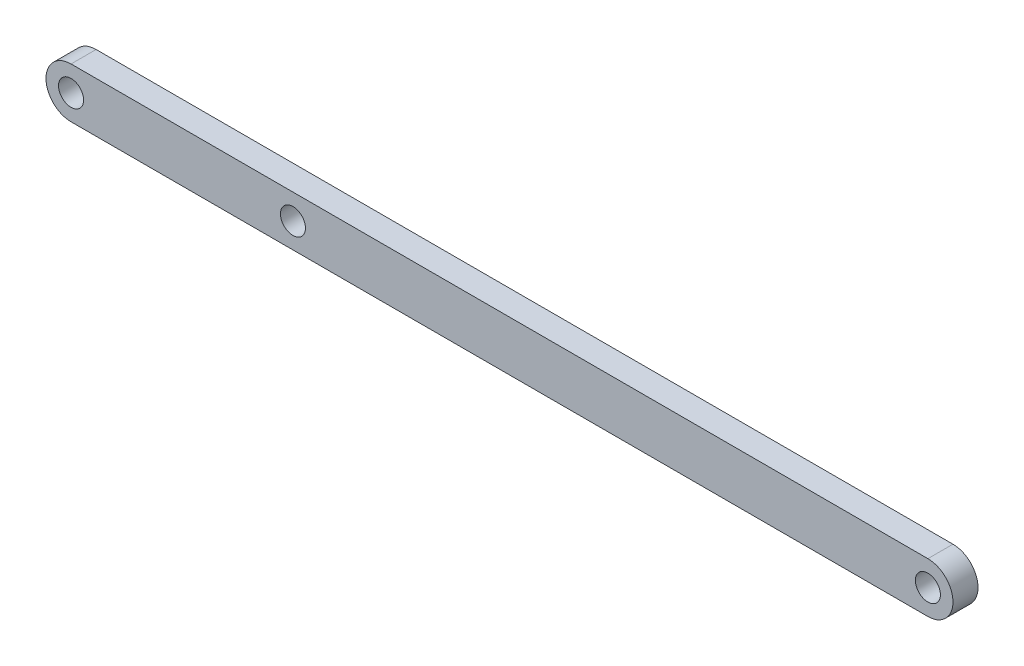
ISO-10303-21;
HEADER;
FILE_DESCRIPTION(('STEP AP214'),'2;1');
FILE_NAME('part.step','',(''),(''),'','','');
FILE_SCHEMA(('AUTOMOTIVE_DESIGN { 1 0 10303 214 1 1 1 1 }'));
ENDSEC;
DATA;
#1=APPLICATION_CONTEXT('core data for automotive mechanical design processes');
#2=APPLICATION_PROTOCOL_DEFINITION('international standard','automotive_design',2000,#1);
#3=PRODUCT_CONTEXT('',#1,'mechanical');
#4=PRODUCT('Part','Part','',(#3));
#5=PRODUCT_RELATED_PRODUCT_CATEGORY('part','',(#4));
#6=PRODUCT_DEFINITION_FORMATION('','',#4);
#7=PRODUCT_DEFINITION_CONTEXT('part definition',#1,'design');
#8=PRODUCT_DEFINITION('design','',#6,#7);
#9=PRODUCT_DEFINITION_SHAPE('','',#8);
#10=(LENGTH_UNIT() NAMED_UNIT(*) SI_UNIT(.MILLI.,.METRE.));
#11=(NAMED_UNIT(*) PLANE_ANGLE_UNIT() SI_UNIT($,.RADIAN.));
#12=(NAMED_UNIT(*) SI_UNIT($,.STERADIAN.) SOLID_ANGLE_UNIT());
#13=UNCERTAINTY_MEASURE_WITH_UNIT(LENGTH_MEASURE(1.E-05),#10,'distance_accuracy_value','');
#14=(GEOMETRIC_REPRESENTATION_CONTEXT(3) GLOBAL_UNCERTAINTY_ASSIGNED_CONTEXT((#13)) GLOBAL_UNIT_ASSIGNED_CONTEXT((#10,
#11,#12)) REPRESENTATION_CONTEXT('',''));
#15=CARTESIAN_POINT('',(0.,0.,0.));
#16=DIRECTION('',(0.,0.,1.));
#17=DIRECTION('',(1.,0.,0.));
#18=AXIS2_PLACEMENT_3D('',#15,#16,#17);
#19=CARTESIAN_POINT('',(85.49,0.,5.));
#20=DIRECTION('',(0.,0.,-1.));
#21=DIRECTION('',(-1.,0.,0.));
#22=AXIS2_PLACEMENT_3D('',#19,#20,#21);
#23=PLANE('',#22);
#24=CARTESIAN_POINT('',(85.49,0.,5.));
#25=DIRECTION('',(0.,0.,1.));
#26=DIRECTION('',(-1.,0.,0.));
#27=AXIS2_PLACEMENT_3D('',#24,#25,#26);
#28=CIRCLE('',#27,5.00000000000003);
#29=CARTESIAN_POINT('',(85.49,-5.00000000000003,5.));
#30=VERTEX_POINT('',#29);
#31=CARTESIAN_POINT('',(85.49,5.00000000000003,5.));
#32=VERTEX_POINT('',#31);
#33=EDGE_CURVE('E95',#30,#32,#28,.T.);
#34=ORIENTED_EDGE('',*,*,#33,.T.);
#35=DIRECTION('',(-1.,0.,0.));
#36=VECTOR('',#35,1.);
#37=CARTESIAN_POINT('',(-85.49,5.,5.));
#38=LINE('',#37,#36);
#39=CARTESIAN_POINT('',(-85.49,5.,5.));
#40=VERTEX_POINT('',#39);
#41=EDGE_CURVE('E90',#32,#40,#38,.T.);
#42=ORIENTED_EDGE('',*,*,#41,.T.);
#43=CARTESIAN_POINT('',(-85.49,0.,5.));
#44=DIRECTION('',(0.,0.,1.));
#45=DIRECTION('',(1.,0.,0.));
#46=AXIS2_PLACEMENT_3D('',#43,#44,#45);
#47=CIRCLE('',#46,5.00000000000003);
#48=CARTESIAN_POINT('',(-85.49,-5.00000000000003,5.));
#49=VERTEX_POINT('',#48);
#50=EDGE_CURVE('E93',#40,#49,#47,.T.);
#51=ORIENTED_EDGE('',*,*,#50,.T.);
#52=DIRECTION('',(1.,0.,0.));
#53=VECTOR('',#52,1.);
#54=CARTESIAN_POINT('',(-85.49,-5.00000000000006,5.));
#55=LINE('',#54,#53);
#56=EDGE_CURVE('E60',#49,#30,#55,.T.);
#57=ORIENTED_EDGE('',*,*,#56,.T.);
#58=EDGE_LOOP('',(#34,#42,#51,#57));
#59=FACE_BOUND('',#58,.T.);
#60=CARTESIAN_POINT('',(-85.49,0.,5.));
#61=DIRECTION('',(0.,0.,1.));
#62=DIRECTION('',(1.,0.,0.));
#63=AXIS2_PLACEMENT_3D('',#60,#61,#62);
#64=CIRCLE('',#63,2.50000000000001);
#65=CARTESIAN_POINT('',(-82.99,0.,5.));
#66=VERTEX_POINT('',#65);
#67=EDGE_CURVE('E115',#66,#66,#64,.T.);
#68=ORIENTED_EDGE('',*,*,#67,.F.);
#69=EDGE_LOOP('',(#68));
#70=FACE_BOUND('',#69,.T.);
#71=CARTESIAN_POINT('',(-41.21,0.,5.));
#72=DIRECTION('',(0.,0.,1.));
#73=DIRECTION('',(1.,0.,0.));
#74=AXIS2_PLACEMENT_3D('',#71,#72,#73);
#75=CIRCLE('',#74,2.5);
#76=CARTESIAN_POINT('',(-38.71,0.,5.));
#77=VERTEX_POINT('',#76);
#78=EDGE_CURVE('E137',#77,#77,#75,.T.);
#79=ORIENTED_EDGE('',*,*,#78,.F.);
#80=EDGE_LOOP('',(#79));
#81=FACE_BOUND('',#80,.T.);
#82=CARTESIAN_POINT('',(85.49,0.,5.));
#83=DIRECTION('',(0.,0.,1.));
#84=DIRECTION('',(1.,0.,0.));
#85=AXIS2_PLACEMENT_3D('',#82,#83,#84);
#86=CIRCLE('',#85,2.50000000000001);
#87=CARTESIAN_POINT('',(87.99,0.,5.));
#88=VERTEX_POINT('',#87);
#89=EDGE_CURVE('E145',#88,#88,#86,.T.);
#90=ORIENTED_EDGE('',*,*,#89,.F.);
#91=EDGE_LOOP('',(#90));
#92=FACE_BOUND('',#91,.T.);
#93=ADVANCED_FACE('F42',(#59,#70,#81,#92),#23,.F.);
#94=CARTESIAN_POINT('',(85.49,0.,0.));
#95=DIRECTION('',(0.,0.,-1.));
#96=DIRECTION('',(-1.,0.,0.));
#97=AXIS2_PLACEMENT_3D('',#94,#95,#96);
#98=PLANE('',#97);
#99=CARTESIAN_POINT('',(-41.21,0.,0.));
#100=DIRECTION('',(0.,0.,1.));
#101=DIRECTION('',(1.,0.,0.));
#102=AXIS2_PLACEMENT_3D('',#99,#100,#101);
#103=CIRCLE('',#102,2.5);
#104=CARTESIAN_POINT('',(-38.71,0.,0.));
#105=VERTEX_POINT('',#104);
#106=EDGE_CURVE('E141',#105,#105,#103,.T.);
#107=ORIENTED_EDGE('',*,*,#106,.T.);
#108=EDGE_LOOP('',(#107));
#109=FACE_BOUND('',#108,.T.);
#110=CARTESIAN_POINT('',(85.49,0.,0.));
#111=DIRECTION('',(0.,0.,1.));
#112=DIRECTION('',(-1.,0.,0.));
#113=AXIS2_PLACEMENT_3D('',#110,#111,#112);
#114=CIRCLE('',#113,5.00000000000003);
#115=CARTESIAN_POINT('',(85.49,-5.00000000000003,0.));
#116=VERTEX_POINT('',#115);
#117=CARTESIAN_POINT('',(85.49,5.00000000000003,0.));
#118=VERTEX_POINT('',#117);
#119=EDGE_CURVE('E111',#116,#118,#114,.T.);
#120=ORIENTED_EDGE('',*,*,#119,.F.);
#121=DIRECTION('',(1.,0.,0.));
#122=VECTOR('',#121,1.);
#123=CARTESIAN_POINT('',(-85.49,-5.00000000000006,0.));
#124=LINE('',#123,#122);
#125=CARTESIAN_POINT('',(-85.49,-5.00000000000003,0.));
#126=VERTEX_POINT('',#125);
#127=EDGE_CURVE('E83',#126,#116,#124,.T.);
#128=ORIENTED_EDGE('',*,*,#127,.F.);
#129=CARTESIAN_POINT('',(-85.49,0.,0.));
#130=DIRECTION('',(0.,0.,1.));
#131=DIRECTION('',(1.,0.,0.));
#132=AXIS2_PLACEMENT_3D('',#129,#130,#131);
#133=CIRCLE('',#132,5.00000000000003);
#134=CARTESIAN_POINT('',(-85.49,5.,0.));
#135=VERTEX_POINT('',#134);
#136=EDGE_CURVE('E77',#135,#126,#133,.T.);
#137=ORIENTED_EDGE('',*,*,#136,.F.);
#138=DIRECTION('',(-1.,0.,0.));
#139=VECTOR('',#138,1.);
#140=CARTESIAN_POINT('',(-85.49,5.,0.));
#141=LINE('',#140,#139);
#142=EDGE_CURVE('E100',#118,#135,#141,.T.);
#143=ORIENTED_EDGE('',*,*,#142,.F.);
#144=EDGE_LOOP('',(#120,#128,#137,#143));
#145=FACE_BOUND('',#144,.T.);
#146=CARTESIAN_POINT('',(-85.49,0.,0.));
#147=DIRECTION('',(0.,0.,1.));
#148=DIRECTION('',(1.,0.,0.));
#149=AXIS2_PLACEMENT_3D('',#146,#147,#148);
#150=CIRCLE('',#149,2.50000000000001);
#151=CARTESIAN_POINT('',(-82.99,0.,0.));
#152=VERTEX_POINT('',#151);
#153=EDGE_CURVE('E133',#152,#152,#150,.T.);
#154=ORIENTED_EDGE('',*,*,#153,.T.);
#155=EDGE_LOOP('',(#154));
#156=FACE_BOUND('',#155,.T.);
#157=CARTESIAN_POINT('',(85.49,0.,0.));
#158=DIRECTION('',(0.,0.,1.));
#159=DIRECTION('',(1.,0.,0.));
#160=AXIS2_PLACEMENT_3D('',#157,#158,#159);
#161=CIRCLE('',#160,2.50000000000001);
#162=CARTESIAN_POINT('',(87.99,0.,0.));
#163=VERTEX_POINT('',#162);
#164=EDGE_CURVE('E149',#163,#163,#161,.T.);
#165=ORIENTED_EDGE('',*,*,#164,.T.);
#166=EDGE_LOOP('',(#165));
#167=FACE_BOUND('',#166,.T.);
#168=ADVANCED_FACE('F128',(#109,#145,#156,#167),#98,.T.);
#169=CARTESIAN_POINT('',(85.49,0.,5.));
#170=DIRECTION('',(0.,0.,-1.));
#171=DIRECTION('',(-1.,0.,0.));
#172=AXIS2_PLACEMENT_3D('',#169,#170,#171);
#173=CYLINDRICAL_SURFACE('',#172,5.00000000000003);
#174=ORIENTED_EDGE('',*,*,#119,.T.);
#175=DIRECTION('',(0.,0.,-1.));
#176=VECTOR('',#175,1.);
#177=CARTESIAN_POINT('',(85.49,5.00000000000003,5.));
#178=LINE('',#177,#176);
#179=EDGE_CURVE('E11',#32,#118,#178,.T.);
#180=ORIENTED_EDGE('',*,*,#179,.F.);
#181=ORIENTED_EDGE('',*,*,#33,.F.);
#182=DIRECTION('',(0.,0.,-1.));
#183=VECTOR('',#182,1.);
#184=CARTESIAN_POINT('',(85.49,-5.00000000000003,5.));
#185=LINE('',#184,#183);
#186=EDGE_CURVE('E107',#30,#116,#185,.T.);
#187=ORIENTED_EDGE('',*,*,#186,.T.);
#188=EDGE_LOOP('',(#174,#180,#181,#187));
#189=FACE_BOUND('',#188,.T.);
#190=ADVANCED_FACE('F44',(#189),#173,.T.);
#191=CARTESIAN_POINT('',(-85.49,5.,5.));
#192=DIRECTION('',(0.,-1.,0.));
#193=DIRECTION('',(1.,0.,0.));
#194=AXIS2_PLACEMENT_3D('',#191,#192,#193);
#195=PLANE('',#194);
#196=ORIENTED_EDGE('',*,*,#142,.T.);
#197=DIRECTION('',(0.,0.,-1.));
#198=VECTOR('',#197,1.);
#199=CARTESIAN_POINT('',(-85.49,5.,5.));
#200=LINE('',#199,#198);
#201=EDGE_CURVE('E52',#40,#135,#200,.T.);
#202=ORIENTED_EDGE('',*,*,#201,.F.);
#203=ORIENTED_EDGE('',*,*,#41,.F.);
#204=ORIENTED_EDGE('',*,*,#179,.T.);
#205=EDGE_LOOP('',(#196,#202,#203,#204));
#206=FACE_BOUND('',#205,.T.);
#207=ADVANCED_FACE('F99',(#206),#195,.F.);
#208=CARTESIAN_POINT('',(-85.49,0.,5.));
#209=DIRECTION('',(0.,0.,-1.));
#210=DIRECTION('',(-1.,0.,0.));
#211=AXIS2_PLACEMENT_3D('',#208,#209,#210);
#212=CYLINDRICAL_SURFACE('',#211,5.00000000000003);
#213=ORIENTED_EDGE('',*,*,#136,.T.);
#214=DIRECTION('',(0.,0.,-1.));
#215=VECTOR('',#214,1.);
#216=CARTESIAN_POINT('',(-85.49,-5.00000000000003,5.));
#217=LINE('',#216,#215);
#218=EDGE_CURVE('E102',#49,#126,#217,.T.);
#219=ORIENTED_EDGE('',*,*,#218,.F.);
#220=ORIENTED_EDGE('',*,*,#50,.F.);
#221=ORIENTED_EDGE('',*,*,#201,.T.);
#222=EDGE_LOOP('',(#213,#219,#220,#221));
#223=FACE_BOUND('',#222,.T.);
#224=ADVANCED_FACE('F103',(#223),#212,.T.);
#225=CARTESIAN_POINT('',(-85.49,-5.00000000000006,5.));
#226=DIRECTION('',(0.,1.,0.));
#227=DIRECTION('',(-1.,0.,0.));
#228=AXIS2_PLACEMENT_3D('',#225,#226,#227);
#229=PLANE('',#228);
#230=ORIENTED_EDGE('',*,*,#127,.T.);
#231=ORIENTED_EDGE('',*,*,#186,.F.);
#232=ORIENTED_EDGE('',*,*,#56,.F.);
#233=ORIENTED_EDGE('',*,*,#218,.T.);
#234=EDGE_LOOP('',(#230,#231,#232,#233));
#235=FACE_BOUND('',#234,.T.);
#236=ADVANCED_FACE('F125',(#235),#229,.F.);
#237=CARTESIAN_POINT('',(-85.49,0.,5.));
#238=DIRECTION('',(0.,0.,-1.));
#239=DIRECTION('',(-1.,0.,0.));
#240=AXIS2_PLACEMENT_3D('',#237,#238,#239);
#241=CYLINDRICAL_SURFACE('',#240,2.50000000000001);
#242=ORIENTED_EDGE('',*,*,#67,.T.);
#243=EDGE_LOOP('',(#242));
#244=FACE_BOUND('',#243,.T.);
#245=ORIENTED_EDGE('',*,*,#153,.F.);
#246=EDGE_LOOP('',(#245));
#247=FACE_BOUND('',#246,.T.);
#248=ADVANCED_FACE('F168',(#244,#247),#241,.F.);
#249=CARTESIAN_POINT('',(-41.21,0.,5.));
#250=DIRECTION('',(0.,0.,-1.));
#251=DIRECTION('',(-1.,0.,0.));
#252=AXIS2_PLACEMENT_3D('',#249,#250,#251);
#253=CYLINDRICAL_SURFACE('',#252,2.5);
#254=ORIENTED_EDGE('',*,*,#78,.T.);
#255=EDGE_LOOP('',(#254));
#256=FACE_BOUND('',#255,.T.);
#257=ORIENTED_EDGE('',*,*,#106,.F.);
#258=EDGE_LOOP('',(#257));
#259=FACE_BOUND('',#258,.T.);
#260=ADVANCED_FACE('F222',(#256,#259),#253,.F.);
#261=CARTESIAN_POINT('',(85.49,0.,5.));
#262=DIRECTION('',(0.,0.,-1.));
#263=DIRECTION('',(-1.,0.,0.));
#264=AXIS2_PLACEMENT_3D('',#261,#262,#263);
#265=CYLINDRICAL_SURFACE('',#264,2.50000000000001);
#266=ORIENTED_EDGE('',*,*,#89,.T.);
#267=EDGE_LOOP('',(#266));
#268=FACE_BOUND('',#267,.T.);
#269=ORIENTED_EDGE('',*,*,#164,.F.);
#270=EDGE_LOOP('',(#269));
#271=FACE_BOUND('',#270,.T.);
#272=ADVANCED_FACE('F157',(#268,#271),#265,.F.);
#273=CLOSED_SHELL('',(#93,#168,#190,#207,#224,#236,#248,#260,#272));
#274=MANIFOLD_SOLID_BREP('B2',#273);
#275=ADVANCED_BREP_SHAPE_REPRESENTATION('',(#18,#274),#14);
#276=SHAPE_DEFINITION_REPRESENTATION(#9,#275);
ENDSEC;
END-ISO-10303-21;
